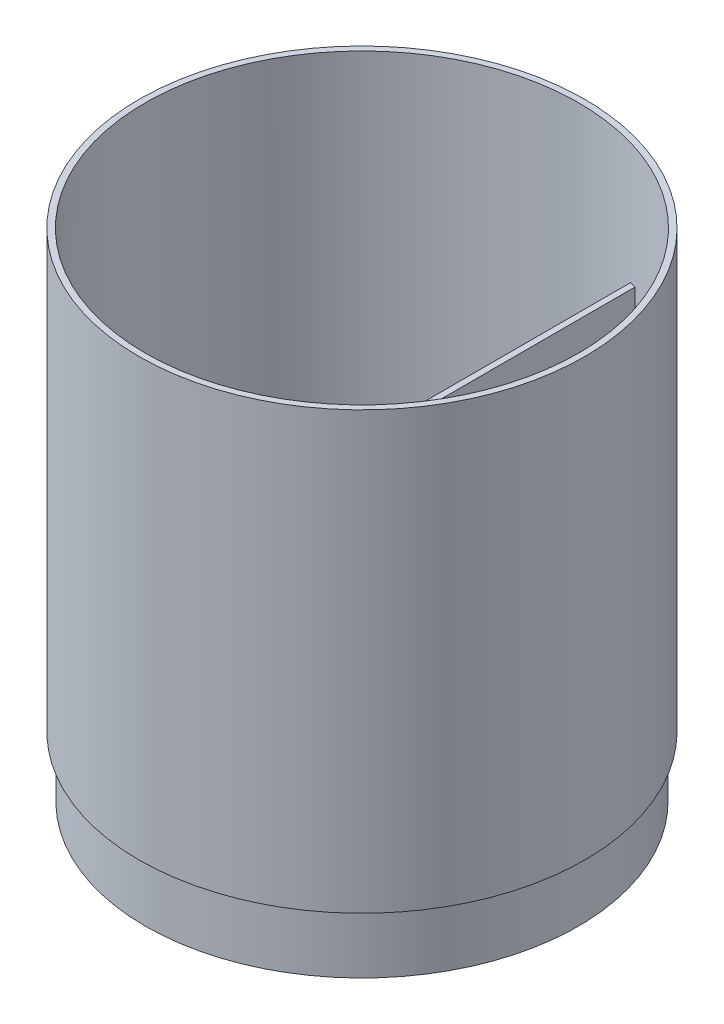
ISO-10303-21;
HEADER;
FILE_DESCRIPTION(('STEP AP214'),'2;1');
FILE_NAME('part.step','',(''),(''),'','','');
FILE_SCHEMA(('AUTOMOTIVE_DESIGN { 1 0 10303 214 1 1 1 1 }'));
ENDSEC;
DATA;
#1=APPLICATION_CONTEXT('core data for automotive mechanical design processes');
#2=APPLICATION_PROTOCOL_DEFINITION('international standard','automotive_design',2000,#1);
#3=PRODUCT_CONTEXT('',#1,'mechanical');
#4=PRODUCT('Part','Part','',(#3));
#5=PRODUCT_RELATED_PRODUCT_CATEGORY('part','',(#4));
#6=PRODUCT_DEFINITION_FORMATION('','',#4);
#7=PRODUCT_DEFINITION_CONTEXT('part definition',#1,'design');
#8=PRODUCT_DEFINITION('design','',#6,#7);
#9=PRODUCT_DEFINITION_SHAPE('','',#8);
#10=(LENGTH_UNIT() NAMED_UNIT(*) SI_UNIT(.MILLI.,.METRE.));
#11=(NAMED_UNIT(*) PLANE_ANGLE_UNIT() SI_UNIT($,.RADIAN.));
#12=(NAMED_UNIT(*) SI_UNIT($,.STERADIAN.) SOLID_ANGLE_UNIT());
#13=UNCERTAINTY_MEASURE_WITH_UNIT(LENGTH_MEASURE(1.E-05),#10,'distance_accuracy_value','');
#14=(GEOMETRIC_REPRESENTATION_CONTEXT(3) GLOBAL_UNCERTAINTY_ASSIGNED_CONTEXT((#13)) GLOBAL_UNIT_ASSIGNED_CONTEXT((#10,
#11,#12)) REPRESENTATION_CONTEXT('',''));
#15=CARTESIAN_POINT('',(0.,0.,0.));
#16=DIRECTION('',(0.,0.,1.));
#17=DIRECTION('',(1.,0.,0.));
#18=AXIS2_PLACEMENT_3D('',#15,#16,#17);
#19=CARTESIAN_POINT('',(0.,12.,0.));
#20=DIRECTION('',(0.,1.,0.));
#21=DIRECTION('',(0.,0.,1.));
#22=AXIS2_PLACEMENT_3D('',#19,#20,#21);
#23=PLANE('',#22);
#24=CARTESIAN_POINT('',(0.,12.,0.));
#25=DIRECTION('',(0.,1.,0.));
#26=DIRECTION('',(0.,0.,1.));
#27=AXIS2_PLACEMENT_3D('',#24,#25,#26);
#28=CIRCLE('',#27,35.8);
#29=CARTESIAN_POINT('',(10.,12.,-34.3749909090897));
#30=VERTEX_POINT('',#29);
#31=CARTESIAN_POINT('',(10.,12.,34.3749909090897));
#32=VERTEX_POINT('',#31);
#33=EDGE_CURVE('E118',#30,#32,#28,.T.);
#34=ORIENTED_EDGE('',*,*,#33,.T.);
#35=DIRECTION('',(0.,0.,1.));
#36=VECTOR('',#35,1.);
#37=CARTESIAN_POINT('',(10.,12.,-34.3749909090897));
#38=LINE('',#37,#36);
#39=CARTESIAN_POINT('',(10.,12.,33.2800615985007));
#40=VERTEX_POINT('',#39);
#41=EDGE_CURVE('E191',#40,#32,#38,.T.);
#42=ORIENTED_EDGE('',*,*,#41,.F.);
#43=CARTESIAN_POINT('',(0.,12.,0.));
#44=DIRECTION('',(0.,1.,0.));
#45=DIRECTION('',(0.,0.,1.));
#46=AXIS2_PLACEMENT_3D('',#43,#44,#45);
#47=CIRCLE('',#46,34.75);
#48=CARTESIAN_POINT('',(10.,12.,-33.2800615985007));
#49=VERTEX_POINT('',#48);
#50=EDGE_CURVE('E139',#49,#40,#47,.T.);
#51=ORIENTED_EDGE('',*,*,#50,.F.);
#52=EDGE_CURVE('E192',#30,#49,#38,.T.);
#53=ORIENTED_EDGE('',*,*,#52,.F.);
#54=EDGE_LOOP('',(#34,#42,#51,#53));
#55=FACE_BOUND('',#54,.T.);
#56=ADVANCED_FACE('F39',(#55),#23,.T.);
#57=CARTESIAN_POINT('',(11.,12.,34.0681669597881));
#58=VERTEX_POINT('',#57);
#59=CARTESIAN_POINT('',(11.,12.,-34.0681669597881));
#60=VERTEX_POINT('',#59);
#61=EDGE_CURVE('E133',#58,#60,#28,.T.);
#62=ORIENTED_EDGE('',*,*,#61,.T.);
#63=DIRECTION('',(0.,0.,-1.));
#64=VECTOR('',#63,1.);
#65=CARTESIAN_POINT('',(11.,12.,-34.3749909090897));
#66=LINE('',#65,#64);
#67=CARTESIAN_POINT('',(11.,12.,-32.963047492609));
#68=VERTEX_POINT('',#67);
#69=EDGE_CURVE('E173',#68,#60,#66,.T.);
#70=ORIENTED_EDGE('',*,*,#69,.F.);
#71=CARTESIAN_POINT('',(11.,12.,32.963047492609));
#72=VERTEX_POINT('',#71);
#73=EDGE_CURVE('E145',#72,#68,#47,.T.);
#74=ORIENTED_EDGE('',*,*,#73,.F.);
#75=EDGE_CURVE('E113',#58,#72,#66,.T.);
#76=ORIENTED_EDGE('',*,*,#75,.F.);
#77=EDGE_LOOP('',(#62,#70,#74,#76));
#78=FACE_BOUND('',#77,.T.);
#79=ADVANCED_FACE('F171',(#78),#23,.T.);
#80=CARTESIAN_POINT('',(0.,82.,0.));
#81=DIRECTION('',(0.,-1.,0.));
#82=DIRECTION('',(0.,0.,-1.));
#83=AXIS2_PLACEMENT_3D('',#80,#81,#82);
#84=CYLINDRICAL_SURFACE('',#83,35.8);
#85=CARTESIAN_POINT('',(-35.0055709852018,20.,7.5));
#86=CARTESIAN_POINT('',(-35.0055684258827,19.7917865356554,7.50000449448403));
#87=CARTESIAN_POINT('',(-35.0074320658096,19.5836278136534,7.49132731776335));
#88=CARTESIAN_POINT('',(-35.0148254376855,19.1687561138279,7.45669777345413));
#89=CARTESIAN_POINT('',(-35.0203557552863,18.9620433722912,7.43074264618126));
#90=CARTESIAN_POINT('',(-35.0349249898873,18.5515213648738,7.3617432742004));
#91=CARTESIAN_POINT('',(-35.0439656129139,18.3477135608152,7.31869071982337));
#92=CARTESIAN_POINT('',(-35.0652914569098,17.9444667455001,7.21582245134723));
#93=CARTESIAN_POINT('',(-35.0775778731133,17.7450293729743,7.15600056159365));
#94=CARTESIAN_POINT('',(-35.1050154857026,17.352276405848,7.02016215813984));
#95=CARTESIAN_POINT('',(-35.1201625506798,17.1589524464672,6.94416897953161));
#96=CARTESIAN_POINT('',(-35.1529041247593,16.7793728695279,6.77647605018639));
#97=CARTESIAN_POINT('',(-35.1704995371124,16.5931198930416,6.68477049989786));
#98=CARTESIAN_POINT('',(-35.2076278096074,16.2290803878695,6.48637945749342));
#99=CARTESIAN_POINT('',(-35.2271598328557,16.0512902507619,6.37970042785586));
#100=CARTESIAN_POINT('',(-35.2676312526466,15.7051928908249,6.15203647538459));
#101=CARTESIAN_POINT('',(-35.2885711814413,15.5368892990446,6.03104612895191));
#102=CARTESIAN_POINT('',(-35.3315645666245,15.2087291451729,5.77388630743311));
#103=CARTESIAN_POINT('',(-35.353629245041,15.0490174266487,5.63753384053272));
#104=CARTESIAN_POINT('',(-35.3979988714237,14.7415319936152,5.35187555532147));
#105=CARTESIAN_POINT('',(-35.4203039242957,14.5937637522513,5.20256386266327));
#106=CARTESIAN_POINT('',(-35.4645262701881,14.3112305410905,4.89203114503272));
#107=CARTESIAN_POINT('',(-35.486443533339,14.1764665694199,4.73080920757866));
#108=CARTESIAN_POINT('',(-35.5292714956164,13.9209378703089,4.39761995288345));
#109=CARTESIAN_POINT('',(-35.5501826463282,13.8001668273286,4.22565753758999));
#110=CARTESIAN_POINT('',(-35.590632556513,13.5722605992995,3.87029301418697));
#111=CARTESIAN_POINT('',(-35.610155392947,13.4652748179198,3.686793223761));
#112=CARTESIAN_POINT('',(-35.6470333758419,13.2672102969469,3.31128142429822));
#113=CARTESIAN_POINT('',(-35.6643893548246,13.1761254427164,3.11927272310128));
#114=CARTESIAN_POINT('',(-35.6964527503138,13.0104830144134,2.72796714608164));
#115=CARTESIAN_POINT('',(-35.7111593450339,12.9359305667156,2.52866803189948));
#116=CARTESIAN_POINT('',(-35.737489529918,12.8040054063312,2.12434969379563));
#117=CARTESIAN_POINT('',(-35.7491143519158,12.7466258281884,1.91933279169132));
#118=CARTESIAN_POINT('',(-35.7688132132261,12.6501565940702,1.50791760637109));
#119=CARTESIAN_POINT('',(-35.7769348318338,12.6108213662167,1.301579170441));
#120=CARTESIAN_POINT('',(-35.789629907325,12.5495968147922,0.88629912703623));
#121=CARTESIAN_POINT('',(-35.7942046941398,12.5277009520169,0.677358525166523));
#122=CARTESIAN_POINT('',(-35.7996813907558,12.5015099994641,0.258309826977666));
#123=CARTESIAN_POINT('',(-35.8005829659736,12.4972165130419,0.0482016260502904));
#124=CARTESIAN_POINT('',(-35.7986866028303,12.5062704660506,-0.371616551136771));
#125=CARTESIAN_POINT('',(-35.7958886962031,12.5196177541603,-0.581326530796918));
#126=CARTESIAN_POINT('',(-35.7867462084506,12.5634918153928,-0.995502835920591));
#127=CARTESIAN_POINT('',(-35.7804584345541,12.5937434753867,-1.19999963190972));
#128=CARTESIAN_POINT('',(-35.7645469708762,12.6709995379861,-1.60574475114384));
#129=CARTESIAN_POINT('',(-35.754922125724,12.7180097429436,-1.80699192400591));
#130=CARTESIAN_POINT('',(-35.7326037193463,12.8283972285886,-2.2046970684112));
#131=CARTESIAN_POINT('',(-35.7199111804438,12.8917690571682,-2.40115661149383));
#132=CARTESIAN_POINT('',(-35.6917948514083,13.0344340714434,-2.78808626483124));
#133=CARTESIAN_POINT('',(-35.676370044671,13.1137331847335,-2.97855411456595));
#134=CARTESIAN_POINT('',(-35.6431010353236,13.2882171247593,-3.35335289538562));
#135=CARTESIAN_POINT('',(-35.6252418768996,13.3835010645734,-3.53763634873815));
#136=CARTESIAN_POINT('',(-35.5876590036216,13.5889415352222,-3.89760058025438));
#137=CARTESIAN_POINT('',(-35.5679346457458,13.6991032007526,-4.07327835972103));
#138=CARTESIAN_POINT('',(-35.5271604121901,13.9334984770372,-4.41479908692029));
#139=CARTESIAN_POINT('',(-35.5061106245788,14.0577311532757,-4.58064268666935));
#140=CARTESIAN_POINT('',(-35.4632510412628,14.3194337685917,-4.90143012187678));
#141=CARTESIAN_POINT('',(-35.4414412351687,14.4569038886672,-5.05637380824846));
#142=CARTESIAN_POINT('',(-35.3972264922276,14.7469462112896,-5.35723091054395));
#143=CARTESIAN_POINT('',(-35.3748181942157,14.899758714456,-5.50291227107128));
#144=CARTESIAN_POINT('',(-35.3304607234369,15.2171007509491,-5.78086073169848));
#145=CARTESIAN_POINT('',(-35.3085113985534,15.3816263199782,-5.9131323339481));
#146=CARTESIAN_POINT('',(-35.2656776787635,15.7213986979253,-6.16344980563783));
#147=CARTESIAN_POINT('',(-35.2447937058199,15.8966496954209,-6.28149006320362));
#148=CARTESIAN_POINT('',(-35.2047070553994,16.256557487722,-6.5023998962783));
#149=CARTESIAN_POINT('',(-35.1855037390646,16.4412106659415,-6.60527524659842));
#150=CARTESIAN_POINT('',(-35.1492749036183,16.8192725133511,-6.79543045871491));
#151=CARTESIAN_POINT('',(-35.1322559369848,17.0127052732578,-6.88266369535614));
#152=CARTESIAN_POINT('',(-35.1009735185707,17.4063880117687,-7.0404638356846));
#153=CARTESIAN_POINT('',(-35.0867090476305,17.6066354365754,-7.11103690576869));
#154=CARTESIAN_POINT('',(-35.0613569102135,18.0125932129078,-7.23500235162283));
#155=CARTESIAN_POINT('',(-35.0502694633851,18.2183039410734,-7.28839353952864));
#156=CARTESIAN_POINT('',(-35.031611867092,18.6336663866756,-7.37755031631316));
#157=CARTESIAN_POINT('',(-35.0240416549662,18.8433180338336,-7.41331621919487));
#158=CARTESIAN_POINT('',(-35.0127598465998,19.2610078344954,-7.4664161612092));
#159=CARTESIAN_POINT('',(-35.0089779300897,19.4690014225684,-7.48408624839978));
#160=CARTESIAN_POINT('',(-35.0051365144443,19.8858463093977,-7.50203328120184));
#161=CARTESIAN_POINT('',(-35.0050783135555,20.0946978819052,-7.50230416070527));
#162=CARTESIAN_POINT('',(-35.0086886640432,20.5115746638942,-7.48543861822651));
#163=CARTESIAN_POINT('',(-35.0123556312459,20.7196001869108,-7.46830959576767));
#164=CARTESIAN_POINT('',(-35.0233061338708,21.133483426099,-7.41678634376094));
#165=CARTESIAN_POINT('',(-35.0305910062737,21.3393403121193,-7.38238573152299));
#166=CARTESIAN_POINT('',(-35.048461199168,21.7450661095991,-7.29707074087852));
#167=CARTESIAN_POINT('',(-35.0590090420776,21.944976101387,-7.24634362950022));
#168=CARTESIAN_POINT('',(-35.0831301979106,22.3398456176357,-7.12864516499942));
#169=CARTESIAN_POINT('',(-35.0967046060211,22.5348033215524,-7.06166793086316));
#170=CARTESIAN_POINT('',(-35.1264884591115,22.9183465981611,-6.91199143073828));
#171=CARTESIAN_POINT('',(-35.1426975582566,23.1069330032435,-6.8292942279424));
#172=CARTESIAN_POINT('',(-35.1772982385849,23.4765166138631,-6.64876910249198));
#173=CARTESIAN_POINT('',(-35.1956899090411,23.6575135085588,-6.55094056087508));
#174=CARTESIAN_POINT('',(-35.2344206546711,24.0132413668053,-6.33934757168769));
#175=CARTESIAN_POINT('',(-35.2547836706981,24.1878468883128,-6.22537659546139));
#176=CARTESIAN_POINT('',(-35.2966615470996,24.5268775662341,-5.98337345036002));
#177=CARTESIAN_POINT('',(-35.3181764163308,24.6913026443487,-5.8553411733586));
#178=CARTESIAN_POINT('',(-35.3617649815921,25.00890951593,-5.58606975563434));
#179=CARTESIAN_POINT('',(-35.3838387397331,25.162090052315,-5.44482914228927));
#180=CARTESIAN_POINT('',(-35.4279367278434,25.4561746301284,-5.15009677220216));
#181=CARTESIAN_POINT('',(-35.449960958545,25.5970788542693,-4.99660519786049));
#182=CARTESIAN_POINT('',(-35.4937329280961,25.8679858061139,-4.67563885943476));
#183=CARTESIAN_POINT('',(-35.5154693923278,25.9977592925774,-4.50796896558684));
#184=CARTESIAN_POINT('',(-35.5576489741182,26.2426718406324,-4.1622009104345));
#185=CARTESIAN_POINT('',(-35.5780925633244,26.3578162546353,-3.98410659820285));
#186=CARTESIAN_POINT('',(-35.6171251077436,26.5727297194475,-3.6185890301503));
#187=CARTESIAN_POINT('',(-35.6357134065325,26.6724933350976,-3.43116250738906));
#188=CARTESIAN_POINT('',(-35.6704927384131,26.8558116134846,-3.0484181291919));
#189=CARTESIAN_POINT('',(-35.6866847120079,26.9393726393857,-2.8531034082107));
#190=CARTESIAN_POINT('',(-35.7161332187192,27.0892555396513,-2.45703716419947));
#191=CARTESIAN_POINT('',(-35.7294060368696,27.1556734306107,-2.25632319727544));
#192=CARTESIAN_POINT('',(-35.7527517433962,27.2713456974085,-1.84990610549198));
#193=CARTESIAN_POINT('',(-35.7628258293828,27.3206064975596,-1.64420487899166));
#194=CARTESIAN_POINT('',(-35.7794931644963,27.4016014552401,-1.22922390820349));
#195=CARTESIAN_POINT('',(-35.7860861513143,27.4333342920052,-1.01994389547216));
#196=CARTESIAN_POINT('',(-35.7956002315845,27.4790037345953,-0.599369100973248));
#197=CARTESIAN_POINT('',(-35.7985213792888,27.4929406033584,-0.388074349020218));
#198=CARTESIAN_POINT('',(-35.8005877261318,27.502806286489,0.0308744435845898));
#199=CARTESIAN_POINT('',(-35.7998046207131,27.4990770249347,0.238520158374109));
#200=CARTESIAN_POINT('',(-35.7946471214984,27.474416898256,0.652815769774815));
#201=CARTESIAN_POINT('',(-35.7902714810643,27.4534800619643,0.859465295658387));
#202=CARTESIAN_POINT('',(-35.7780511055552,27.3945769778383,1.27013611037246));
#203=CARTESIAN_POINT('',(-35.770207703204,27.3566172721215,1.47415837793606));
#204=CARTESIAN_POINT('',(-35.7512653021832,27.2639538815144,1.87828836252593));
#205=CARTESIAN_POINT('',(-35.7401650971023,27.209243991557,2.07839459959155));
#206=CARTESIAN_POINT('',(-35.7150542728488,27.0837044539757,2.47260805251535));
#207=CARTESIAN_POINT('',(-35.701052787381,27.0129253295941,2.66673194990143));
#208=CARTESIAN_POINT('',(-35.6704930014892,26.8556560070136,3.04837537327593));
#209=CARTESIAN_POINT('',(-35.6539338227801,26.7691604101366,3.23589260333716));
#210=CARTESIAN_POINT('',(-35.6187101190416,26.581112036948,3.6029834438903));
#211=CARTESIAN_POINT('',(-35.6000458263382,26.4795609218166,3.78255792792613));
#212=CARTESIAN_POINT('',(-35.5611097868679,26.2621056961862,4.13261306174583));
#213=CARTESIAN_POINT('',(-35.5408380098153,26.1462013152437,4.30309354009426));
#214=CARTESIAN_POINT('',(-35.498858274292,25.8986503885403,4.63679240658329));
#215=CARTESIAN_POINT('',(-35.477131219976,25.7667610905721,4.79982835700957));
#216=CARTESIAN_POINT('',(-35.4331787326185,25.4898839503055,5.11419920133682));
#217=CARTESIAN_POINT('',(-35.410953465243,25.344900414929,5.26553791248762));
#218=CARTESIAN_POINT('',(-35.366598763275,25.0426834937009,5.55564966353754));
#219=CARTESIAN_POINT('',(-35.3444693925959,24.8854429669847,5.69441527507309));
#220=CARTESIAN_POINT('',(-35.300943892079,24.5598954688326,5.95829178544293));
#221=CARTESIAN_POINT('',(-35.279547497275,24.3915925619861,6.08340765508017));
#222=CARTESIAN_POINT('',(-35.237822375266,24.0428284669506,6.32064606305668));
#223=CARTESIAN_POINT('',(-35.2175102512154,23.862242024418,6.43258749954776));
#224=CARTESIAN_POINT('',(-35.1788450629835,23.4921336475223,6.6407884408798));
#225=CARTESIAN_POINT('',(-35.1604912780648,23.30261503779,6.7370537220061));
#226=CARTESIAN_POINT('',(-35.1262873617079,22.9160063203855,6.91317515637668));
#227=CARTESIAN_POINT('',(-35.1104357765896,22.7189206922171,6.99304084531595));
#228=CARTESIAN_POINT('',(-35.0817014393819,22.318551583288,7.13579042500305));
#229=CARTESIAN_POINT('',(-35.0688181335845,22.1152692664928,7.1986774833511));
#230=CARTESIAN_POINT('',(-35.0406870286439,21.5986998195206,7.33466977575751));
#231=CARTESIAN_POINT('',(-35.0275941927545,21.2822735278201,7.39657978111283));
#232=CARTESIAN_POINT('',(-35.0100383266525,20.6438544006962,7.4792405728725));
#233=CARTESIAN_POINT('',(-35.0055749414638,20.3218617947954,7.49999305230955));
#234=CARTESIAN_POINT('',(-35.0055709852018,20.,7.5));
#235=B_SPLINE_CURVE_WITH_KNOTS('',3,(#85,#86,#87,#88,#89,#90,#91,#92,#93,#94,#95,#96,#97,#98,
#99,#100,#101,#102,#103,#104,#105,#106,#107,#108,#109,#110,#111,#112,#113,#114,#115,#116,#117,
#118,#119,#120,#121,#122,#123,#124,#125,#126,#127,#128,#129,#130,#131,#132,#133,#134,#135,#136,
#137,#138,#139,#140,#141,#142,#143,#144,#145,#146,#147,#148,#149,#150,#151,#152,#153,#154,#155,
#156,#157,#158,#159,#160,#161,#162,#163,#164,#165,#166,#167,#168,#169,#170,#171,#172,#173,#174,
#175,#176,#177,#178,#179,#180,#181,#182,#183,#184,#185,#186,#187,#188,#189,#190,#191,#192,#193,
#194,#195,#196,#197,#198,#199,#200,#201,#202,#203,#204,#205,#206,#207,#208,#209,#210,#211,#212,
#213,#214,#215,#216,#217,#218,#219,#220,#221,#222,#223,#224,#225,#226,#227,#228,#229,#230,#231,
#232,#233,#234),.UNSPECIFIED.,.T.,.F.,(4,2,2,2,2,2,2,2,2,2,2,2,2,2,2,2,2,2,2,2,2,2,2,2,2,2,2,2,
2,2,2,2,2,2,2,2,2,2,2,2,2,2,2,2,2,2,2,2,2,2,2,2,2,2,2,2,2,2,2,2,2,2,2,2,2,2,2,2,2,2,2,2,2,2,4),
(0.,0.62435723451637,1.24881421711488,1.87357506963482,2.49856630620878,3.12266172594639,
3.74698800210301,4.37104564603016,4.99534055312308,5.62806994420995,6.26108766122173,
6.89415392612855,7.52693334189276,8.16607869479441,8.80497772292348,9.44407458494143,
10.0829156032511,10.712783764949,11.3424156348947,11.9721048551186,12.6017886739475,
13.2215111373717,13.8414483775448,14.461179304931,15.0811413039206,15.7050999416837,
16.3292744769802,16.9534075824708,17.5775492230615,18.213739134076,18.8497147403973,
19.4859403176243,20.1219229901824,20.7597709450813,21.3973824430316,22.035038012595,
22.6726822216047,23.298257714786,23.9240513091605,24.5495788884406,25.1753378008327,
25.7941607233894,26.4132079364959,27.032173957775,27.6511653051697,28.2789446802751,
28.9067288831157,29.5345831624323,30.162428095584,30.8010739706429,31.4394855041075,
32.0781221204405,32.7165074178711,33.3512355592783,33.9857257764917,34.620263797189,
35.2547924423841,35.8770906665741,36.4996049244862,37.121880146556,37.7443861685395,
38.3649614297415,38.9857502656861,39.6064706565862,40.2272027448497,40.8589446025104,
41.4904794208408,42.1223849584314,42.7540596024706,43.3935963057492,44.0328968193157,
44.6718245464257,45.3106329901627,46.2758203649648,47.2409680355414),.UNSPECIFIED.);
#236=CARTESIAN_POINT('',(-35.0055709852018,20.,7.5));
#237=VERTEX_POINT('',#236);
#238=EDGE_CURVE('E197',#237,#237,#235,.T.);
#239=ORIENTED_EDGE('',*,*,#238,.F.);
#240=EDGE_LOOP('',(#239));
#241=FACE_BOUND('',#240,.T.);
#242=CARTESIAN_POINT('',(0.,82.,0.));
#243=DIRECTION('',(0.,1.,0.));
#244=DIRECTION('',(0.,0.,1.));
#245=AXIS2_PLACEMENT_3D('',#242,#243,#244);
#246=CIRCLE('',#245,35.8);
#247=CARTESIAN_POINT('',(0.,82.,35.8));
#248=VERTEX_POINT('',#247);
#249=EDGE_CURVE('E128',#248,#248,#246,.T.);
#250=ORIENTED_EDGE('',*,*,#249,.T.);
#251=EDGE_LOOP('',(#250));
#252=FACE_BOUND('',#251,.T.);
#253=ORIENTED_EDGE('',*,*,#33,.F.);
#254=DIRECTION('',(0.,-1.,0.));
#255=VECTOR('',#254,1.);
#256=CARTESIAN_POINT('',(10.,62.,-34.3749909090897));
#257=LINE('',#256,#255);
#258=CARTESIAN_POINT('',(10.,62.,-34.3749909090897));
#259=VERTEX_POINT('',#258);
#260=EDGE_CURVE('E110',#259,#30,#257,.T.);
#261=ORIENTED_EDGE('',*,*,#260,.F.);
#262=CARTESIAN_POINT('',(0.,62.,0.));
#263=DIRECTION('',(0.,-1.,0.));
#264=DIRECTION('',(0.,0.,-1.));
#265=AXIS2_PLACEMENT_3D('',#262,#263,#264);
#266=CIRCLE('',#265,35.8);
#267=CARTESIAN_POINT('',(11.,62.,-34.0681669597881));
#268=VERTEX_POINT('',#267);
#269=EDGE_CURVE('E97',#259,#268,#266,.T.);
#270=ORIENTED_EDGE('',*,*,#269,.T.);
#271=DIRECTION('',(0.,-1.,0.));
#272=VECTOR('',#271,1.);
#273=CARTESIAN_POINT('',(11.,82.,-34.0681669597881));
#274=LINE('',#273,#272);
#275=EDGE_CURVE('E53',#268,#60,#274,.T.);
#276=ORIENTED_EDGE('',*,*,#275,.T.);
#277=ORIENTED_EDGE('',*,*,#61,.F.);
#278=DIRECTION('',(0.,-1.,0.));
#279=VECTOR('',#278,1.);
#280=CARTESIAN_POINT('',(11.,82.,34.0681669597881));
#281=LINE('',#280,#279);
#282=CARTESIAN_POINT('',(11.,62.,34.0681669597881));
#283=VERTEX_POINT('',#282);
#284=EDGE_CURVE('E105',#58,#283,#281,.F.);
#285=ORIENTED_EDGE('',*,*,#284,.T.);
#286=CARTESIAN_POINT('',(10.,62.,34.3749909090897));
#287=VERTEX_POINT('',#286);
#288=EDGE_CURVE('E107',#283,#287,#266,.T.);
#289=ORIENTED_EDGE('',*,*,#288,.T.);
#290=DIRECTION('',(0.,-1.,0.));
#291=VECTOR('',#290,1.);
#292=CARTESIAN_POINT('',(10.,62.,34.3749909090897));
#293=LINE('',#292,#291);
#294=EDGE_CURVE('E68',#287,#32,#293,.T.);
#295=ORIENTED_EDGE('',*,*,#294,.T.);
#296=EDGE_LOOP('',(#253,#261,#270,#276,#277,#285,#289,#295));
#297=FACE_BOUND('',#296,.T.);
#298=ADVANCED_FACE('F116',(#241,#252,#297),#84,.F.);
#299=CARTESIAN_POINT('',(0.,0.,0.));
#300=DIRECTION('',(0.,1.,0.));
#301=DIRECTION('',(0.,0.,1.));
#302=AXIS2_PLACEMENT_3D('',#299,#300,#301);
#303=PLANE('',#302);
#304=CARTESIAN_POINT('',(0.,0.,0.));
#305=DIRECTION('',(0.,1.,0.));
#306=DIRECTION('',(0.,0.,1.));
#307=AXIS2_PLACEMENT_3D('',#304,#305,#306);
#308=CIRCLE('',#307,35.75);
#309=CARTESIAN_POINT('',(0.,0.,35.75));
#310=VERTEX_POINT('',#309);
#311=EDGE_CURVE('E153',#310,#310,#308,.T.);
#312=ORIENTED_EDGE('',*,*,#311,.F.);
#313=EDGE_LOOP('',(#312));
#314=FACE_BOUND('',#313,.T.);
#315=CARTESIAN_POINT('',(0.,0.,0.));
#316=DIRECTION('',(0.,1.,0.));
#317=DIRECTION('',(0.,0.,1.));
#318=AXIS2_PLACEMENT_3D('',#315,#316,#317);
#319=CIRCLE('',#318,34.75);
#320=CARTESIAN_POINT('',(0.,0.,34.75));
#321=VERTEX_POINT('',#320);
#322=EDGE_CURVE('E149',#321,#321,#319,.T.);
#323=ORIENTED_EDGE('',*,*,#322,.T.);
#324=EDGE_LOOP('',(#323));
#325=FACE_BOUND('',#324,.T.);
#326=ADVANCED_FACE('F246',(#314,#325),#303,.F.);
#327=CARTESIAN_POINT('',(0.,10.,0.));
#328=DIRECTION('',(0.,-1.,0.));
#329=DIRECTION('',(0.,0.,-1.));
#330=AXIS2_PLACEMENT_3D('',#327,#328,#329);
#331=CYLINDRICAL_SURFACE('',#330,35.75);
#332=CARTESIAN_POINT('',(0.,10.,0.));
#333=DIRECTION('',(0.,1.,0.));
#334=DIRECTION('',(0.,0.,1.));
#335=AXIS2_PLACEMENT_3D('',#332,#333,#334);
#336=CIRCLE('',#335,35.75);
#337=CARTESIAN_POINT('',(0.,10.,35.75));
#338=VERTEX_POINT('',#337);
#339=EDGE_CURVE('E154',#338,#338,#336,.T.);
#340=ORIENTED_EDGE('',*,*,#339,.F.);
#341=EDGE_LOOP('',(#340));
#342=FACE_BOUND('',#341,.T.);
#343=ORIENTED_EDGE('',*,*,#311,.T.);
#344=EDGE_LOOP('',(#343));
#345=FACE_BOUND('',#344,.T.);
#346=ADVANCED_FACE('F41',(#342,#345),#331,.T.);
#347=CARTESIAN_POINT('',(0.,10.,0.));
#348=DIRECTION('',(0.,-1.,0.));
#349=DIRECTION('',(0.,0.,-1.));
#350=AXIS2_PLACEMENT_3D('',#347,#348,#349);
#351=CYLINDRICAL_SURFACE('',#350,34.75);
#352=ORIENTED_EDGE('',*,*,#322,.F.);
#353=EDGE_LOOP('',(#352));
#354=FACE_BOUND('',#353,.T.);
#355=EDGE_CURVE('E140',#40,#72,#47,.T.);
#356=ORIENTED_EDGE('',*,*,#355,.T.);
#357=ORIENTED_EDGE('',*,*,#73,.T.);
#358=CARTESIAN_POINT('',(0.,12.,0.));
#359=DIRECTION('',(0.,-1.,0.));
#360=DIRECTION('',(0.,0.,-1.));
#361=AXIS2_PLACEMENT_3D('',#358,#359,#360);
#362=CIRCLE('',#361,34.75);
#363=EDGE_CURVE('E120',#49,#68,#362,.T.);
#364=ORIENTED_EDGE('',*,*,#363,.F.);
#365=ORIENTED_EDGE('',*,*,#50,.T.);
#366=EDGE_LOOP('',(#356,#357,#364,#365));
#367=FACE_BOUND('',#366,.T.);
#368=ADVANCED_FACE('F182',(#354,#367),#351,.F.);
#369=CARTESIAN_POINT('',(0.,10.,0.));
#370=DIRECTION('',(0.,1.,0.));
#371=DIRECTION('',(0.,0.,1.));
#372=AXIS2_PLACEMENT_3D('',#369,#370,#371);
#373=PLANE('',#372);
#374=ORIENTED_EDGE('',*,*,#339,.T.);
#375=EDGE_LOOP('',(#374));
#376=FACE_BOUND('',#375,.T.);
#377=CARTESIAN_POINT('',(0.,10.,0.));
#378=DIRECTION('',(0.,1.,0.));
#379=DIRECTION('',(0.,0.,1.));
#380=AXIS2_PLACEMENT_3D('',#377,#378,#379);
#381=CIRCLE('',#380,36.8);
#382=CARTESIAN_POINT('',(0.,10.,36.8));
#383=VERTEX_POINT('',#382);
#384=EDGE_CURVE('E144',#383,#383,#381,.T.);
#385=ORIENTED_EDGE('',*,*,#384,.F.);
#386=EDGE_LOOP('',(#385));
#387=FACE_BOUND('',#386,.T.);
#388=ADVANCED_FACE('F236',(#376,#387),#373,.F.);
#389=CARTESIAN_POINT('',(0.,12.,0.));
#390=DIRECTION('',(0.,-1.,0.));
#391=DIRECTION('',(0.,0.,-1.));
#392=AXIS2_PLACEMENT_3D('',#389,#390,#391);
#393=CYLINDRICAL_SURFACE('',#392,36.8);
#394=CARTESIAN_POINT('',(-36.0276282871909,20.,7.5));
#395=CARTESIAN_POINT('',(-36.0276259046702,19.7916516209837,7.50000429593396));
#396=CARTESIAN_POINT('',(-36.029438947901,19.583356351673,7.49131598454937));
#397=CARTESIAN_POINT('',(-36.0366320237001,19.1682105252984,7.45664089020514));
#398=CARTESIAN_POINT('',(-36.0420126462117,18.9613602128938,7.430651246254));
#399=CARTESIAN_POINT('',(-36.0561881128384,18.5505576492873,7.3615577604294));
#400=CARTESIAN_POINT('',(-36.0649846894063,18.3466069231492,7.31844523417485));
#401=CARTESIAN_POINT('',(-36.0857357591813,17.9430748629157,7.21543032450573));
#402=CARTESIAN_POINT('',(-36.0976914151133,17.7434951669618,7.15552175867538));
#403=CARTESIAN_POINT('',(-36.1243919722596,17.3504546021888,7.01947987136749));
#404=CARTESIAN_POINT('',(-36.1391329409277,17.1569855499753,6.94336940618314));
#405=CARTESIAN_POINT('',(-36.1709979872033,16.7771233491693,6.77541206881585));
#406=CARTESIAN_POINT('',(-36.1881229441691,16.5907328440093,6.68355938705312));
#407=CARTESIAN_POINT('',(-36.2242593361487,16.2264329321339,6.48484569938033));
#408=CARTESIAN_POINT('',(-36.2432699381579,16.0485198313998,6.37799131205028));
#409=CARTESIAN_POINT('',(-36.2826613148386,15.7021951013576,6.14994929629825));
#410=CARTESIAN_POINT('',(-36.3030426072854,15.5337871072675,6.02875623820034));
#411=CARTESIAN_POINT('',(-36.3448728875437,15.205563339947,5.77125972971761));
#412=CARTESIAN_POINT('',(-36.3663321829726,15.0458846763987,5.63478315353431));
#413=CARTESIAN_POINT('',(-36.4094827978831,14.7384779897249,5.34887533862754));
#414=CARTESIAN_POINT('',(-36.4311742186142,14.590755444092,5.19943822647456));
#415=CARTESIAN_POINT('',(-36.4741775667059,14.3083293293745,4.88865778483915));
#416=CARTESIAN_POINT('',(-36.495489465746,14.1736267285695,4.72731357140931));
#417=CARTESIAN_POINT('',(-36.5371313103142,13.9182375056047,4.39388714952834));
#418=CARTESIAN_POINT('',(-36.5574616964332,13.797544559839,4.22180984007277));
#419=CARTESIAN_POINT('',(-36.5967734841959,13.5698735149654,3.86632207489012));
#420=CARTESIAN_POINT('',(-36.6157402014554,13.4630369150447,3.68281932536194));
#421=CARTESIAN_POINT('',(-36.6515640028969,13.2652689440586,3.30732621228478));
#422=CARTESIAN_POINT('',(-36.6684218960637,13.1743314684316,3.11533914196774));
#423=CARTESIAN_POINT('',(-36.6995611200412,13.0089781965435,2.72410160098699));
#424=CARTESIAN_POINT('',(-36.713841642702,12.9345675806973,2.52484887559287));
#425=CARTESIAN_POINT('',(-36.7394044681066,12.8029163645634,2.12064741614966));
#426=CARTESIAN_POINT('',(-36.7506879637369,12.7456689317573,1.91570098431482));
#427=CARTESIAN_POINT('',(-36.7698102444165,12.6494121318935,1.50429182897943));
#428=CARTESIAN_POINT('',(-36.777692836459,12.6101703873585,1.29788549916593));
#429=CARTESIAN_POINT('',(-36.7900038259728,12.5491425593435,0.882483229531853));
#430=CARTESIAN_POINT('',(-36.7944335138912,12.5273499545482,0.673488286842759));
#431=CARTESIAN_POINT('',(-36.7997179621086,12.5013731636777,0.254341724392555));
#432=CARTESIAN_POINT('',(-36.8005723814143,12.4971906571759,0.0441899962162289));
#433=CARTESIAN_POINT('',(-36.7986809916432,12.5064732212407,-0.375706102172827));
#434=CARTESIAN_POINT('',(-36.7959352117343,12.5199381488326,-0.585450475672042));
#435=CARTESIAN_POINT('',(-36.7869893803748,12.5640707097651,-0.99986277837447));
#436=CARTESIAN_POINT('',(-36.7808417091024,12.5944775302681,-1.20455967948616));
#437=CARTESIAN_POINT('',(-36.7652958424508,12.6720792621564,-1.61069364022775));
#438=CARTESIAN_POINT('',(-36.7558965201424,12.719279993992,-1.81212954432043));
#439=CARTESIAN_POINT('',(-36.7341088133589,12.8300838988687,-2.21019765563978));
#440=CARTESIAN_POINT('',(-36.7217214290751,12.8936815838611,-2.40683144607074));
#441=CARTESIAN_POINT('',(-36.6942876925486,13.036833871787,-2.79409199720778));
#442=CARTESIAN_POINT('',(-36.6792403480677,13.1163944308106,-2.98471648490268));
#443=CARTESIAN_POINT('',(-36.6467972033002,13.2914098961387,-3.3597471163016));
#444=CARTESIAN_POINT('',(-36.6293875775084,13.3869592100177,-3.54410799862685));
#445=CARTESIAN_POINT('',(-36.5927578840317,13.5929568429497,-3.90420818818778));
#446=CARTESIAN_POINT('',(-36.5735371529965,13.7034106274877,-4.07994430032087));
#447=CARTESIAN_POINT('',(-36.533816194124,13.9383891238918,-4.42151949234793));
#448=CARTESIAN_POINT('',(-36.5133163037836,14.0629101311918,-4.58736116041918));
#449=CARTESIAN_POINT('',(-36.471578236571,14.3252497448693,-4.90817299742749));
#450=CARTESIAN_POINT('',(-36.4503397868602,14.4630732995865,-5.0631390835094));
#451=CARTESIAN_POINT('',(-36.4073272139954,14.7536226157967,-5.36376680966933));
#452=CARTESIAN_POINT('',(-36.3855502749137,14.9065695067869,-5.5092144150811));
#453=CARTESIAN_POINT('',(-36.3424389834209,15.2242653027771,-5.78678392281634));
#454=CARTESIAN_POINT('',(-36.3211047896392,15.3890183467282,-5.91890111234516));
#455=CARTESIAN_POINT('',(-36.2794950389145,15.7291408882444,-6.16881598501615));
#456=CARTESIAN_POINT('',(-36.2592193346099,15.9045089006263,-6.28661566447355));
#457=CARTESIAN_POINT('',(-36.2203051903025,16.2646881169774,-6.5070751497878));
#458=CARTESIAN_POINT('',(-36.2016667313362,16.4494992115315,-6.60973513101186));
#459=CARTESIAN_POINT('',(-36.1665247966988,16.8277673248228,-6.79939813885817));
#460=CARTESIAN_POINT('',(-36.1500267613264,17.0212447559871,-6.88636148053046));
#461=CARTESIAN_POINT('',(-36.1197147334737,17.4149853235518,-7.04362287977137));
#462=CARTESIAN_POINT('',(-36.1058998072636,17.6152460707436,-7.11392673677018));
#463=CARTESIAN_POINT('',(-36.08136121431,18.0211941672836,-7.23735704565856));
#464=CARTESIAN_POINT('',(-36.0706377463017,18.2268818645772,-7.2904823932507));
#465=CARTESIAN_POINT('',(-36.0526099906451,18.6421655450405,-7.37911664274345));
#466=CARTESIAN_POINT('',(-36.0453056497402,18.8517614672825,-7.41462581903554));
#467=CARTESIAN_POINT('',(-36.0344388583138,19.269520198953,-7.46725685419009));
#468=CARTESIAN_POINT('',(-36.0308116228312,19.4776412502927,-7.48469718412323));
#469=CARTESIAN_POINT('',(-36.027178443749,19.8947183812549,-7.50216598240947));
#470=CARTESIAN_POINT('',(-36.0271737586116,20.1036747258463,-7.5021883998367));
#471=CARTESIAN_POINT('',(-36.0307886061059,20.520777159309,-7.48480795852205));
#472=CARTESIAN_POINT('',(-36.0344072406215,20.7289234361375,-7.46740941793108));
#473=CARTESIAN_POINT('',(-36.0451594364495,21.142955924438,-7.41533453805604));
#474=CARTESIAN_POINT('',(-36.0522930811668,21.3488420821629,-7.38065778879098));
#475=CARTESIAN_POINT('',(-36.0697749944966,21.7548182717439,-7.2947398813011));
#476=CARTESIAN_POINT('',(-36.0800902064227,21.9549457740483,-7.24366884792458));
#477=CARTESIAN_POINT('',(-36.1036602926525,22.3501484305468,-7.12526165819035));
#478=CARTESIAN_POINT('',(-36.1169151415382,22.54522362841,-7.05792564246955));
#479=CARTESIAN_POINT('',(-36.1459886554577,22.9290128442988,-6.90748645462211));
#480=CARTESIAN_POINT('',(-36.1618075068974,23.11772639862,-6.82438213604752));
#481=CARTESIAN_POINT('',(-36.1955644913186,23.4875201888194,-6.64301247163813));
#482=CARTESIAN_POINT('',(-36.2135026200305,23.6686004400755,-6.54474715634843));
#483=CARTESIAN_POINT('',(-36.2512591556432,24.0243642102463,-6.33229842126175));
#484=CARTESIAN_POINT('',(-36.2710999373942,24.1989262553927,-6.21791553971978));
#485=CARTESIAN_POINT('',(-36.3118862965389,24.5377716695124,-5.97511974167524));
#486=CARTESIAN_POINT('',(-36.332831489251,24.7020585744381,-5.84671169385309));
#487=CARTESIAN_POINT('',(-36.375262468042,25.0194087452764,-5.57664478138504));
#488=CARTESIAN_POINT('',(-36.396748495107,25.172466884545,-5.43497993051161));
#489=CARTESIAN_POINT('',(-36.4396534146231,25.4662098730366,-5.1394494561109));
#490=CARTESIAN_POINT('',(-36.4610723283068,25.6068991209541,-4.98558820725444));
#491=CARTESIAN_POINT('',(-36.5036113387254,25.8772232886788,-4.66402028680313));
#492=CARTESIAN_POINT('',(-36.5247207817053,26.006639197818,-4.49612800024791));
#493=CARTESIAN_POINT('',(-36.5656703385912,26.2508186998835,-4.14995353372074));
#494=CARTESIAN_POINT('',(-36.5855109171445,26.3655876718984,-3.97167520326115));
#495=CARTESIAN_POINT('',(-36.6233778258544,26.5797354581308,-3.60583158092558));
#496=CARTESIAN_POINT('',(-36.641403512558,26.6791088206601,-3.41826303020717));
#497=CARTESIAN_POINT('',(-36.6751143141511,26.8616365883091,-3.03527970050846));
#498=CARTESIAN_POINT('',(-36.6908003446093,26.9447973417796,-2.83986802893934));
#499=CARTESIAN_POINT('',(-36.7193135993476,27.0938931024466,-2.44361301929206));
#500=CARTESIAN_POINT('',(-36.7321561193607,27.159920619817,-2.24280559873912));
#501=CARTESIAN_POINT('',(-36.7547225914525,27.2748063486855,-1.83624543695909));
#502=CARTESIAN_POINT('',(-36.7644477070267,27.3236709664715,-1.6304945716447));
#503=CARTESIAN_POINT('',(-36.7805083846423,27.4038735169019,-1.21545579524813));
#504=CARTESIAN_POINT('',(-36.7868436721731,27.4352100301178,-1.00616759912577));
#505=CARTESIAN_POINT('',(-36.7959411706415,27.4800916840238,-0.585615921385102));
#506=CARTESIAN_POINT('',(-36.7987034312761,27.4936370721697,-0.374352467281724));
#507=CARTESIAN_POINT('',(-36.8005584774043,27.5027409434267,0.0447143876790609));
#508=CARTESIAN_POINT('',(-36.7997173440923,27.4986233392148,0.252510530913366));
#509=CARTESIAN_POINT('',(-36.7945376237247,27.4731622679866,0.667074014783202));
#510=CARTESIAN_POINT('',(-36.7901978216997,27.4518128169287,0.873840972915808));
#511=CARTESIAN_POINT('',(-36.7781421067541,27.3920626818509,1.2847141416238));
#512=CARTESIAN_POINT('',(-36.7704274843832,27.3536685157401,1.48882133861177));
#513=CARTESIAN_POINT('',(-36.7518323368859,27.2601157041115,1.89308800106443));
#514=CARTESIAN_POINT('',(-36.7409506389549,27.2049508478761,2.09324597471376));
#515=CARTESIAN_POINT('',(-36.7163548007749,27.0784563966319,2.48761396513824));
#516=CARTESIAN_POINT('',(-36.7026482988728,27.0071703442138,2.68183843293156));
#517=CARTESIAN_POINT('',(-36.6727573349819,26.8488807502042,3.06358131404825));
#518=CARTESIAN_POINT('',(-36.6565727873607,26.7618766654355,3.25109949535025));
#519=CARTESIAN_POINT('',(-36.6221623396184,26.572778251754,3.61817835897311));
#520=CARTESIAN_POINT('',(-36.6039363531319,26.4706832843464,3.79773870418007));
#521=CARTESIAN_POINT('',(-36.5659328292095,26.2521212869894,4.14771558362763));
#522=CARTESIAN_POINT('',(-36.5461552700631,26.1356540559233,4.31813198986547));
#523=CARTESIAN_POINT('',(-36.5052382874015,25.887078772079,4.65147821331916));
#524=CARTESIAN_POINT('',(-36.4840816244698,25.754741797239,4.81423525056412));
#525=CARTESIAN_POINT('',(-36.4412962496135,25.4769427636033,5.12806136167396));
#526=CARTESIAN_POINT('',(-36.4196675426886,25.3314808437769,5.27913055926038));
#527=CARTESIAN_POINT('',(-36.3765275669497,25.0283464924643,5.56863315363414));
#528=CARTESIAN_POINT('',(-36.3550163522928,24.8706688676007,5.70706112104182));
#529=CARTESIAN_POINT('',(-36.3127284773631,24.5442734387876,5.97021858669684));
#530=CARTESIAN_POINT('',(-36.2919515512601,24.37555969457,6.09495307748655));
#531=CARTESIAN_POINT('',(-36.2514734049909,24.0261370520559,6.33128922282782));
#532=CARTESIAN_POINT('',(-36.2317875712393,23.8453111300101,6.44272059539566));
#533=CARTESIAN_POINT('',(-36.1943382945277,23.4747782085908,6.64988388494969));
#534=CARTESIAN_POINT('',(-36.1765741442959,23.2850745137441,6.74562158469223));
#535=CARTESIAN_POINT('',(-36.1434946786631,22.8981572139395,6.92067438133843));
#536=CARTESIAN_POINT('',(-36.1281778993387,22.7009481864648,6.99999930417518));
#537=CARTESIAN_POINT('',(-36.10044110772,22.3003919987116,7.14166242081261));
#538=CARTESIAN_POINT('',(-36.0880205429714,22.0970460174322,7.20400385460564));
#539=CARTESIAN_POINT('',(-36.0610913941978,21.5832569667724,7.33788315041856));
#540=CARTESIAN_POINT('',(-36.0486131724299,21.2698160118948,7.398592142425));
#541=CARTESIAN_POINT('',(-36.0318835934353,20.6375418131973,7.47964653451211));
#542=CARTESIAN_POINT('',(-36.0276319317129,20.3187087693996,7.49999342854582));
#543=CARTESIAN_POINT('',(-36.0276282871909,20.,7.5));
#544=B_SPLINE_CURVE_WITH_KNOTS('',3,(#394,#395,#396,#397,#398,#399,#400,#401,#402,#403,#404,
#405,#406,#407,#408,#409,#410,#411,#412,#413,#414,#415,#416,#417,#418,#419,#420,#421,#422,#423,
#424,#425,#426,#427,#428,#429,#430,#431,#432,#433,#434,#435,#436,#437,#438,#439,#440,#441,#442,
#443,#444,#445,#446,#447,#448,#449,#450,#451,#452,#453,#454,#455,#456,#457,#458,#459,#460,#461,
#462,#463,#464,#465,#466,#467,#468,#469,#470,#471,#472,#473,#474,#475,#476,#477,#478,#479,#480,
#481,#482,#483,#484,#485,#486,#487,#488,#489,#490,#491,#492,#493,#494,#495,#496,#497,#498,#499,
#500,#501,#502,#503,#504,#505,#506,#507,#508,#509,#510,#511,#512,#513,#514,#515,#516,#517,#518,
#519,#520,#521,#522,#523,#524,#525,#526,#527,#528,#529,#530,#531,#532,#533,#534,#535,#536,#537,
#538,#539,#540,#541,#542,#543),.UNSPECIFIED.,.T.,.F.,(4,2,2,2,2,2,2,2,2,2,2,2,2,2,2,2,2,2,2,2,2,
2,2,2,2,2,2,2,2,2,2,2,2,2,2,2,2,2,2,2,2,2,2,2,2,2,2,2,2,2,2,2,2,2,2,2,2,2,2,2,2,2,2,2,2,2,2,2,2,
2,2,2,2,2,4),(0.,0.624764890184279,1.24963311872092,1.87481867337582,2.50023465396468,
3.12477412834068,3.74954458389147,4.37404025907976,4.99877317576217,5.63148026072807,
6.26447558800154,6.89751795430813,7.53027346084597,8.16905261791437,8.80758597079235,
9.44631919309184,10.0847978024144,10.7147870258465,11.344540691616,11.9743544191491,
12.6041630441381,13.2245337458035,13.8451196659311,14.4654981454251,15.086108533336,
15.7105218013666,16.3351646678116,16.9596434179788,17.5843553663719,18.2201583461377,
18.8561853238943,19.4921235173233,20.1280543439304,20.7655711016442,21.4028656025827,
22.0402010630027,22.6775265959019,23.303417354353,23.9295255451103,24.5554785801906,
25.1814464687244,25.8011179368512,26.4207840471146,27.0404952280087,27.6602051603776,
28.2883970194967,28.9163714977468,29.5446309245417,30.1726660147188,30.8109960665289,
31.4490910128279,32.0874113988948,32.7254813344082,33.3600307673527,33.9943430936727,
34.6287067792687,35.2630616414359,35.8858336118414,36.5088219431339,37.1315722482588,
37.7545534590599,38.3758717084553,38.9972114332131,39.6185774543685,40.2399521715377,
40.8717145238597,41.5034701877511,42.135495925505,42.7672904605587,43.406459389747,
44.0453922679279,44.6839415185106,45.32236886565,46.278101858501,47.2337994754197),.UNSPECIFIED.);
#545=CARTESIAN_POINT('',(-36.0276282871909,20.,7.5));
#546=VERTEX_POINT('',#545);
#547=EDGE_CURVE('E11',#546,#546,#544,.T.);
#548=ORIENTED_EDGE('',*,*,#547,.T.);
#549=EDGE_LOOP('',(#548));
#550=FACE_BOUND('',#549,.T.);
#551=ORIENTED_EDGE('',*,*,#384,.T.);
#552=EDGE_LOOP('',(#551));
#553=FACE_BOUND('',#552,.T.);
#554=CARTESIAN_POINT('',(0.,82.,0.));
#555=DIRECTION('',(0.,1.,0.));
#556=DIRECTION('',(0.,0.,1.));
#557=AXIS2_PLACEMENT_3D('',#554,#555,#556);
#558=CIRCLE('',#557,36.8);
#559=CARTESIAN_POINT('',(0.,82.,36.8));
#560=VERTEX_POINT('',#559);
#561=EDGE_CURVE('E132',#560,#560,#558,.T.);
#562=ORIENTED_EDGE('',*,*,#561,.F.);
#563=EDGE_LOOP('',(#562));
#564=FACE_BOUND('',#563,.T.);
#565=ADVANCED_FACE('F238',(#550,#553,#564),#393,.T.);
#566=CARTESIAN_POINT('',(0.,82.,0.));
#567=DIRECTION('',(0.,1.,0.));
#568=DIRECTION('',(0.,0.,1.));
#569=AXIS2_PLACEMENT_3D('',#566,#567,#568);
#570=PLANE('',#569);
#571=ORIENTED_EDGE('',*,*,#561,.T.);
#572=EDGE_LOOP('',(#571));
#573=FACE_BOUND('',#572,.T.);
#574=ORIENTED_EDGE('',*,*,#249,.F.);
#575=EDGE_LOOP('',(#574));
#576=FACE_BOUND('',#575,.T.);
#577=ADVANCED_FACE('F223',(#573,#576),#570,.T.);
#578=CARTESIAN_POINT('',(0.,62.,0.));
#579=DIRECTION('',(0.,-1.,0.));
#580=DIRECTION('',(0.,0.,-1.));
#581=AXIS2_PLACEMENT_3D('',#578,#579,#580);
#582=PLANE('',#581);
#583=ORIENTED_EDGE('',*,*,#269,.F.);
#584=DIRECTION('',(0.,0.,1.));
#585=VECTOR('',#584,1.);
#586=CARTESIAN_POINT('',(10.,62.,-34.3749909090897));
#587=LINE('',#586,#585);
#588=EDGE_CURVE('E99',#259,#287,#587,.T.);
#589=ORIENTED_EDGE('',*,*,#588,.T.);
#590=ORIENTED_EDGE('',*,*,#288,.F.);
#591=DIRECTION('',(0.,0.,-1.));
#592=VECTOR('',#591,1.);
#593=CARTESIAN_POINT('',(11.,62.,-34.3749909090897));
#594=LINE('',#593,#592);
#595=EDGE_CURVE('E60',#283,#268,#594,.T.);
#596=ORIENTED_EDGE('',*,*,#595,.T.);
#597=EDGE_LOOP('',(#583,#589,#590,#596));
#598=FACE_BOUND('',#597,.T.);
#599=ADVANCED_FACE('F98',(#598),#582,.F.);
#600=CARTESIAN_POINT('',(0.,12.,0.));
#601=DIRECTION('',(0.,-1.,0.));
#602=DIRECTION('',(0.,0.,-1.));
#603=AXIS2_PLACEMENT_3D('',#600,#601,#602);
#604=PLANE('',#603);
#605=EDGE_CURVE('E187',#49,#40,#38,.T.);
#606=ORIENTED_EDGE('',*,*,#605,.F.);
#607=ORIENTED_EDGE('',*,*,#363,.T.);
#608=EDGE_CURVE('E189',#72,#68,#66,.T.);
#609=ORIENTED_EDGE('',*,*,#608,.F.);
#610=ORIENTED_EDGE('',*,*,#355,.F.);
#611=EDGE_LOOP('',(#606,#607,#609,#610));
#612=FACE_BOUND('',#611,.T.);
#613=ADVANCED_FACE('F186',(#612),#604,.T.);
#614=CARTESIAN_POINT('',(10.,62.,-34.3749909090897));
#615=DIRECTION('',(1.,0.,0.));
#616=DIRECTION('',(0.,0.,-1.));
#617=AXIS2_PLACEMENT_3D('',#614,#615,#616);
#618=PLANE('',#617);
#619=ORIENTED_EDGE('',*,*,#52,.T.);
#620=ORIENTED_EDGE('',*,*,#605,.T.);
#621=ORIENTED_EDGE('',*,*,#41,.T.);
#622=ORIENTED_EDGE('',*,*,#294,.F.);
#623=ORIENTED_EDGE('',*,*,#588,.F.);
#624=ORIENTED_EDGE('',*,*,#260,.T.);
#625=EDGE_LOOP('',(#619,#620,#621,#622,#623,#624));
#626=FACE_BOUND('',#625,.T.);
#627=ADVANCED_FACE('F109',(#626),#618,.F.);
#628=CARTESIAN_POINT('',(11.,62.,-34.3749909090897));
#629=DIRECTION('',(-1.,0.,0.));
#630=DIRECTION('',(0.,0.,1.));
#631=AXIS2_PLACEMENT_3D('',#628,#629,#630);
#632=PLANE('',#631);
#633=ORIENTED_EDGE('',*,*,#275,.F.);
#634=ORIENTED_EDGE('',*,*,#595,.F.);
#635=ORIENTED_EDGE('',*,*,#284,.F.);
#636=ORIENTED_EDGE('',*,*,#75,.T.);
#637=ORIENTED_EDGE('',*,*,#608,.T.);
#638=ORIENTED_EDGE('',*,*,#69,.T.);
#639=EDGE_LOOP('',(#633,#634,#635,#636,#637,#638));
#640=FACE_BOUND('',#639,.T.);
#641=ADVANCED_FACE('F206',(#640),#632,.F.);
#642=CARTESIAN_POINT('',(-26.8,20.,0.));
#643=DIRECTION('',(-1.,0.,0.));
#644=DIRECTION('',(0.,0.,1.));
#645=AXIS2_PLACEMENT_3D('',#642,#643,#644);
#646=CYLINDRICAL_SURFACE('',#645,7.5);
#647=ORIENTED_EDGE('',*,*,#238,.T.);
#648=EDGE_LOOP('',(#647));
#649=FACE_BOUND('',#648,.T.);
#650=ORIENTED_EDGE('',*,*,#547,.F.);
#651=EDGE_LOOP('',(#650));
#652=FACE_BOUND('',#651,.T.);
#653=ADVANCED_FACE('F215',(#649,#652),#646,.F.);
#654=CLOSED_SHELL('',(#56,#79,#298,#326,#346,#368,#388,#565,#577,#599,#613,#627,#641,#653));
#655=MANIFOLD_SOLID_BREP('B2',#654);
#656=ADVANCED_BREP_SHAPE_REPRESENTATION('',(#18,#655),#14);
#657=SHAPE_DEFINITION_REPRESENTATION(#9,#656);
ENDSEC;
END-ISO-10303-21;
